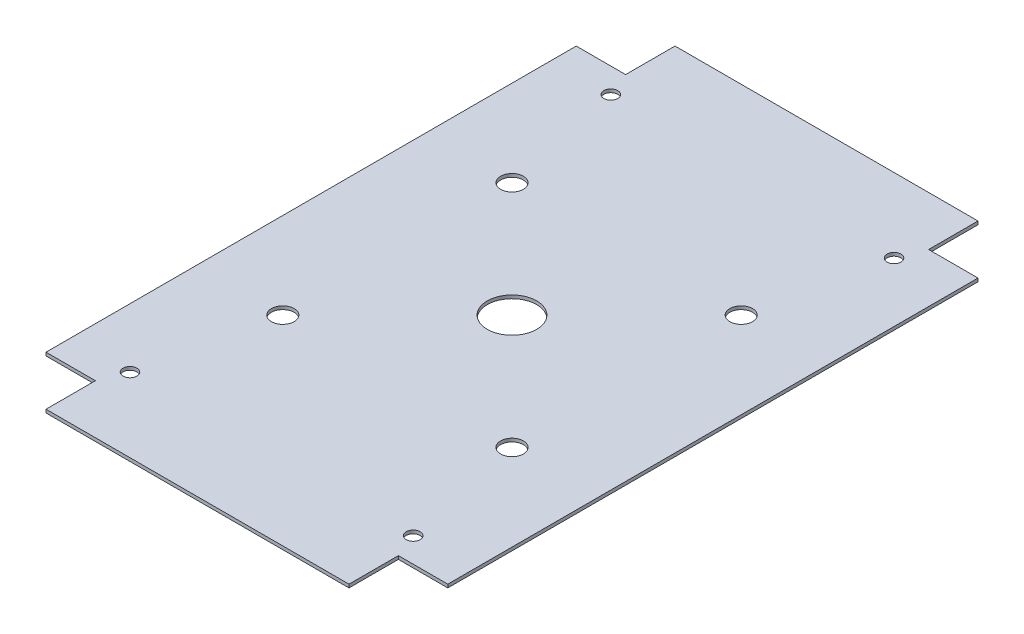
ISO-10303-21;
HEADER;
FILE_DESCRIPTION(('STEP AP214'),'2;1');
FILE_NAME('part.step','',(''),(''),'','','');
FILE_SCHEMA(('AUTOMOTIVE_DESIGN { 1 0 10303 214 1 1 1 1 }'));
ENDSEC;
DATA;
#1=APPLICATION_CONTEXT('core data for automotive mechanical design processes');
#2=APPLICATION_PROTOCOL_DEFINITION('international standard','automotive_design',2000,#1);
#3=PRODUCT_CONTEXT('',#1,'mechanical');
#4=PRODUCT('Part','Part','',(#3));
#5=PRODUCT_RELATED_PRODUCT_CATEGORY('part','',(#4));
#6=PRODUCT_DEFINITION_FORMATION('','',#4);
#7=PRODUCT_DEFINITION_CONTEXT('part definition',#1,'design');
#8=PRODUCT_DEFINITION('design','',#6,#7);
#9=PRODUCT_DEFINITION_SHAPE('','',#8);
#10=(LENGTH_UNIT() NAMED_UNIT(*) SI_UNIT(.MILLI.,.METRE.));
#11=(NAMED_UNIT(*) PLANE_ANGLE_UNIT() SI_UNIT($,.RADIAN.));
#12=(NAMED_UNIT(*) SI_UNIT($,.STERADIAN.) SOLID_ANGLE_UNIT());
#13=UNCERTAINTY_MEASURE_WITH_UNIT(LENGTH_MEASURE(1.E-05),#10,'distance_accuracy_value','');
#14=(GEOMETRIC_REPRESENTATION_CONTEXT(3) GLOBAL_UNCERTAINTY_ASSIGNED_CONTEXT((#13)) GLOBAL_UNIT_ASSIGNED_CONTEXT((#10,
#11,#12)) REPRESENTATION_CONTEXT('',''));
#15=CARTESIAN_POINT('',(0.,0.,0.));
#16=DIRECTION('',(0.,0.,1.));
#17=DIRECTION('',(1.,0.,0.));
#18=AXIS2_PLACEMENT_3D('',#15,#16,#17);
#19=CARTESIAN_POINT('',(-46.,1.,0.));
#20=DIRECTION('',(-1.,0.,0.));
#21=DIRECTION('',(0.,0.,1.));
#22=AXIS2_PLACEMENT_3D('',#19,#20,#21);
#23=PLANE('',#22);
#24=DIRECTION('',(0.,0.,-1.));
#25=VECTOR('',#24,1.);
#26=CARTESIAN_POINT('',(-46.,0.,0.));
#27=LINE('',#26,#25);
#28=CARTESIAN_POINT('',(-46.,0.,95.5));
#29=VERTEX_POINT('',#28);
#30=CARTESIAN_POINT('',(-46.,0.,80.5));
#31=VERTEX_POINT('',#30);
#32=EDGE_CURVE('E182',#29,#31,#27,.T.);
#33=ORIENTED_EDGE('',*,*,#32,.F.);
#34=DIRECTION('',(0.,-1.,0.));
#35=VECTOR('',#34,1.);
#36=CARTESIAN_POINT('',(-46.,1.,95.5));
#37=LINE('',#36,#35);
#38=CARTESIAN_POINT('',(-46.,1.,95.5));
#39=VERTEX_POINT('',#38);
#40=EDGE_CURVE('E11',#39,#29,#37,.T.);
#41=ORIENTED_EDGE('',*,*,#40,.F.);
#42=DIRECTION('',(0.,0.,-1.));
#43=VECTOR('',#42,1.);
#44=CARTESIAN_POINT('',(-46.,1.,0.));
#45=LINE('',#44,#43);
#46=CARTESIAN_POINT('',(-46.,1.,80.5));
#47=VERTEX_POINT('',#46);
#48=EDGE_CURVE('E255',#39,#47,#45,.T.);
#49=ORIENTED_EDGE('',*,*,#48,.T.);
#50=DIRECTION('',(0.,-1.,0.));
#51=VECTOR('',#50,1.);
#52=CARTESIAN_POINT('',(-46.,1.,80.5));
#53=LINE('',#52,#51);
#54=EDGE_CURVE('E54',#47,#31,#53,.T.);
#55=ORIENTED_EDGE('',*,*,#54,.T.);
#56=EDGE_LOOP('',(#33,#41,#49,#55));
#57=FACE_BOUND('',#56,.T.);
#58=ADVANCED_FACE('F37',(#57),#23,.T.);
#59=CARTESIAN_POINT('',(0.,1.,95.5));
#60=DIRECTION('',(0.,0.,1.));
#61=DIRECTION('',(1.,0.,0.));
#62=AXIS2_PLACEMENT_3D('',#59,#60,#61);
#63=PLANE('',#62);
#64=DIRECTION('',(-1.,0.,0.));
#65=VECTOR('',#64,1.);
#66=CARTESIAN_POINT('',(0.,0.,95.5));
#67=LINE('',#66,#65);
#68=CARTESIAN_POINT('',(46.,0.,95.5));
#69=VERTEX_POINT('',#68);
#70=EDGE_CURVE('E184',#69,#29,#67,.T.);
#71=ORIENTED_EDGE('',*,*,#70,.F.);
#72=DIRECTION('',(0.,-1.,0.));
#73=VECTOR('',#72,1.);
#74=CARTESIAN_POINT('',(46.,1.,95.5));
#75=LINE('',#74,#73);
#76=CARTESIAN_POINT('',(46.,1.,95.5));
#77=VERTEX_POINT('',#76);
#78=EDGE_CURVE('E46',#77,#69,#75,.T.);
#79=ORIENTED_EDGE('',*,*,#78,.F.);
#80=DIRECTION('',(-1.,0.,0.));
#81=VECTOR('',#80,1.);
#82=CARTESIAN_POINT('',(0.,1.,95.5));
#83=LINE('',#82,#81);
#84=EDGE_CURVE('E251',#77,#39,#83,.T.);
#85=ORIENTED_EDGE('',*,*,#84,.T.);
#86=ORIENTED_EDGE('',*,*,#40,.T.);
#87=EDGE_LOOP('',(#71,#79,#85,#86));
#88=FACE_BOUND('',#87,.T.);
#89=ADVANCED_FACE('F239',(#88),#63,.T.);
#90=CARTESIAN_POINT('',(46.,1.,0.));
#91=DIRECTION('',(1.,0.,0.));
#92=DIRECTION('',(0.,0.,-1.));
#93=AXIS2_PLACEMENT_3D('',#90,#91,#92);
#94=PLANE('',#93);
#95=DIRECTION('',(0.,0.,1.));
#96=VECTOR('',#95,1.);
#97=CARTESIAN_POINT('',(46.,0.,0.));
#98=LINE('',#97,#96);
#99=CARTESIAN_POINT('',(46.,0.,80.5));
#100=VERTEX_POINT('',#99);
#101=EDGE_CURVE('E187',#100,#69,#98,.T.);
#102=ORIENTED_EDGE('',*,*,#101,.F.);
#103=DIRECTION('',(0.,-1.,0.));
#104=VECTOR('',#103,1.);
#105=CARTESIAN_POINT('',(46.,1.,80.5));
#106=LINE('',#105,#104);
#107=CARTESIAN_POINT('',(46.,1.,80.5));
#108=VERTEX_POINT('',#107);
#109=EDGE_CURVE('E228',#108,#100,#106,.T.);
#110=ORIENTED_EDGE('',*,*,#109,.F.);
#111=DIRECTION('',(0.,0.,1.));
#112=VECTOR('',#111,1.);
#113=CARTESIAN_POINT('',(46.,1.,0.));
#114=LINE('',#113,#112);
#115=EDGE_CURVE('E235',#108,#77,#114,.T.);
#116=ORIENTED_EDGE('',*,*,#115,.T.);
#117=ORIENTED_EDGE('',*,*,#78,.T.);
#118=EDGE_LOOP('',(#102,#110,#116,#117));
#119=FACE_BOUND('',#118,.T.);
#120=ADVANCED_FACE('F233',(#119),#94,.T.);
#121=CARTESIAN_POINT('',(0.,1.,80.5));
#122=DIRECTION('',(0.,0.,1.));
#123=DIRECTION('',(1.,0.,0.));
#124=AXIS2_PLACEMENT_3D('',#121,#122,#123);
#125=PLANE('',#124);
#126=DIRECTION('',(-1.,0.,0.));
#127=VECTOR('',#126,1.);
#128=CARTESIAN_POINT('',(0.,0.,80.5));
#129=LINE('',#128,#127);
#130=CARTESIAN_POINT('',(61.,0.,80.5));
#131=VERTEX_POINT('',#130);
#132=EDGE_CURVE('E190',#131,#100,#129,.T.);
#133=ORIENTED_EDGE('',*,*,#132,.F.);
#134=DIRECTION('',(0.,-1.,0.));
#135=VECTOR('',#134,1.);
#136=CARTESIAN_POINT('',(61.,1.,80.5));
#137=LINE('',#136,#135);
#138=CARTESIAN_POINT('',(61.,1.,80.5));
#139=VERTEX_POINT('',#138);
#140=EDGE_CURVE('E226',#139,#131,#137,.T.);
#141=ORIENTED_EDGE('',*,*,#140,.F.);
#142=DIRECTION('',(-1.,0.,0.));
#143=VECTOR('',#142,1.);
#144=CARTESIAN_POINT('',(0.,1.,80.5));
#145=LINE('',#144,#143);
#146=EDGE_CURVE('E248',#139,#108,#145,.T.);
#147=ORIENTED_EDGE('',*,*,#146,.T.);
#148=ORIENTED_EDGE('',*,*,#109,.T.);
#149=EDGE_LOOP('',(#133,#141,#147,#148));
#150=FACE_BOUND('',#149,.T.);
#151=ADVANCED_FACE('F245',(#150),#125,.T.);
#152=CARTESIAN_POINT('',(61.,1.,0.));
#153=DIRECTION('',(1.,0.,0.));
#154=DIRECTION('',(0.,0.,-1.));
#155=AXIS2_PLACEMENT_3D('',#152,#153,#154);
#156=PLANE('',#155);
#157=DIRECTION('',(0.,0.,1.));
#158=VECTOR('',#157,1.);
#159=CARTESIAN_POINT('',(61.,0.,0.));
#160=LINE('',#159,#158);
#161=CARTESIAN_POINT('',(61.,0.,-80.5));
#162=VERTEX_POINT('',#161);
#163=EDGE_CURVE('E193',#162,#131,#160,.T.);
#164=ORIENTED_EDGE('',*,*,#163,.F.);
#165=DIRECTION('',(0.,-1.,0.));
#166=VECTOR('',#165,1.);
#167=CARTESIAN_POINT('',(61.,1.,-80.5));
#168=LINE('',#167,#166);
#169=CARTESIAN_POINT('',(61.,1.,-80.5));
#170=VERTEX_POINT('',#169);
#171=EDGE_CURVE('E224',#170,#162,#168,.T.);
#172=ORIENTED_EDGE('',*,*,#171,.F.);
#173=DIRECTION('',(0.,0.,1.));
#174=VECTOR('',#173,1.);
#175=CARTESIAN_POINT('',(61.,1.,0.));
#176=LINE('',#175,#174);
#177=EDGE_CURVE('E253',#170,#139,#176,.T.);
#178=ORIENTED_EDGE('',*,*,#177,.T.);
#179=ORIENTED_EDGE('',*,*,#140,.T.);
#180=EDGE_LOOP('',(#164,#172,#178,#179));
#181=FACE_BOUND('',#180,.T.);
#182=ADVANCED_FACE('F470',(#181),#156,.T.);
#183=CARTESIAN_POINT('',(0.,1.,-80.5));
#184=DIRECTION('',(0.,0.,-1.));
#185=DIRECTION('',(-1.,0.,0.));
#186=AXIS2_PLACEMENT_3D('',#183,#184,#185);
#187=PLANE('',#186);
#188=DIRECTION('',(1.,0.,0.));
#189=VECTOR('',#188,1.);
#190=CARTESIAN_POINT('',(0.,0.,-80.5));
#191=LINE('',#190,#189);
#192=CARTESIAN_POINT('',(46.,0.,-80.5));
#193=VERTEX_POINT('',#192);
#194=EDGE_CURVE('E196',#193,#162,#191,.T.);
#195=ORIENTED_EDGE('',*,*,#194,.F.);
#196=DIRECTION('',(0.,-1.,0.));
#197=VECTOR('',#196,1.);
#198=CARTESIAN_POINT('',(46.,1.,-80.5));
#199=LINE('',#198,#197);
#200=CARTESIAN_POINT('',(46.,1.,-80.5));
#201=VERTEX_POINT('',#200);
#202=EDGE_CURVE('E222',#201,#193,#199,.T.);
#203=ORIENTED_EDGE('',*,*,#202,.F.);
#204=DIRECTION('',(1.,0.,0.));
#205=VECTOR('',#204,1.);
#206=CARTESIAN_POINT('',(0.,1.,-80.5));
#207=LINE('',#206,#205);
#208=EDGE_CURVE('E260',#201,#170,#207,.T.);
#209=ORIENTED_EDGE('',*,*,#208,.T.);
#210=ORIENTED_EDGE('',*,*,#171,.T.);
#211=EDGE_LOOP('',(#195,#203,#209,#210));
#212=FACE_BOUND('',#211,.T.);
#213=ADVANCED_FACE('F460',(#212),#187,.T.);
#214=CARTESIAN_POINT('',(46.,1.,0.));
#215=DIRECTION('',(1.,0.,0.));
#216=DIRECTION('',(0.,0.,-1.));
#217=AXIS2_PLACEMENT_3D('',#214,#215,#216);
#218=PLANE('',#217);
#219=DIRECTION('',(0.,0.,1.));
#220=VECTOR('',#219,1.);
#221=CARTESIAN_POINT('',(46.,0.,0.));
#222=LINE('',#221,#220);
#223=CARTESIAN_POINT('',(46.,0.,-95.5));
#224=VERTEX_POINT('',#223);
#225=EDGE_CURVE('E199',#224,#193,#222,.T.);
#226=ORIENTED_EDGE('',*,*,#225,.F.);
#227=DIRECTION('',(0.,-1.,0.));
#228=VECTOR('',#227,1.);
#229=CARTESIAN_POINT('',(46.,1.,-95.5));
#230=LINE('',#229,#228);
#231=CARTESIAN_POINT('',(46.,1.,-95.5));
#232=VERTEX_POINT('',#231);
#233=EDGE_CURVE('E220',#232,#224,#230,.T.);
#234=ORIENTED_EDGE('',*,*,#233,.F.);
#235=DIRECTION('',(0.,0.,1.));
#236=VECTOR('',#235,1.);
#237=CARTESIAN_POINT('',(46.,1.,0.));
#238=LINE('',#237,#236);
#239=EDGE_CURVE('E263',#232,#201,#238,.T.);
#240=ORIENTED_EDGE('',*,*,#239,.T.);
#241=ORIENTED_EDGE('',*,*,#202,.T.);
#242=EDGE_LOOP('',(#226,#234,#240,#241));
#243=FACE_BOUND('',#242,.T.);
#244=ADVANCED_FACE('F450',(#243),#218,.T.);
#245=CARTESIAN_POINT('',(0.,1.,-95.5));
#246=DIRECTION('',(0.,0.,-1.));
#247=DIRECTION('',(-1.,0.,0.));
#248=AXIS2_PLACEMENT_3D('',#245,#246,#247);
#249=PLANE('',#248);
#250=DIRECTION('',(1.,0.,0.));
#251=VECTOR('',#250,1.);
#252=CARTESIAN_POINT('',(0.,0.,-95.5));
#253=LINE('',#252,#251);
#254=CARTESIAN_POINT('',(-46.,0.,-95.5));
#255=VERTEX_POINT('',#254);
#256=EDGE_CURVE('E202',#255,#224,#253,.T.);
#257=ORIENTED_EDGE('',*,*,#256,.F.);
#258=DIRECTION('',(0.,-1.,0.));
#259=VECTOR('',#258,1.);
#260=CARTESIAN_POINT('',(-46.,1.,-95.5));
#261=LINE('',#260,#259);
#262=CARTESIAN_POINT('',(-46.,1.,-95.5));
#263=VERTEX_POINT('',#262);
#264=EDGE_CURVE('E218',#263,#255,#261,.T.);
#265=ORIENTED_EDGE('',*,*,#264,.F.);
#266=DIRECTION('',(1.,0.,0.));
#267=VECTOR('',#266,1.);
#268=CARTESIAN_POINT('',(0.,1.,-95.5));
#269=LINE('',#268,#267);
#270=EDGE_CURVE('E266',#263,#232,#269,.T.);
#271=ORIENTED_EDGE('',*,*,#270,.T.);
#272=ORIENTED_EDGE('',*,*,#233,.T.);
#273=EDGE_LOOP('',(#257,#265,#271,#272));
#274=FACE_BOUND('',#273,.T.);
#275=ADVANCED_FACE('F441',(#274),#249,.T.);
#276=CARTESIAN_POINT('',(-46.,1.,0.));
#277=DIRECTION('',(-1.,0.,0.));
#278=DIRECTION('',(0.,0.,1.));
#279=AXIS2_PLACEMENT_3D('',#276,#277,#278);
#280=PLANE('',#279);
#281=DIRECTION('',(0.,0.,-1.));
#282=VECTOR('',#281,1.);
#283=CARTESIAN_POINT('',(-46.,0.,0.));
#284=LINE('',#283,#282);
#285=CARTESIAN_POINT('',(-46.,0.,-80.5));
#286=VERTEX_POINT('',#285);
#287=EDGE_CURVE('E205',#286,#255,#284,.T.);
#288=ORIENTED_EDGE('',*,*,#287,.F.);
#289=DIRECTION('',(0.,-1.,0.));
#290=VECTOR('',#289,1.);
#291=CARTESIAN_POINT('',(-46.,1.,-80.5));
#292=LINE('',#291,#290);
#293=CARTESIAN_POINT('',(-46.,1.,-80.5));
#294=VERTEX_POINT('',#293);
#295=EDGE_CURVE('E137',#294,#286,#292,.T.);
#296=ORIENTED_EDGE('',*,*,#295,.F.);
#297=DIRECTION('',(0.,0.,-1.));
#298=VECTOR('',#297,1.);
#299=CARTESIAN_POINT('',(-46.,1.,0.));
#300=LINE('',#299,#298);
#301=EDGE_CURVE('E147',#294,#263,#300,.T.);
#302=ORIENTED_EDGE('',*,*,#301,.T.);
#303=ORIENTED_EDGE('',*,*,#264,.T.);
#304=EDGE_LOOP('',(#288,#296,#302,#303));
#305=FACE_BOUND('',#304,.T.);
#306=ADVANCED_FACE('F270',(#305),#280,.T.);
#307=CARTESIAN_POINT('',(0.,1.,-80.5));
#308=DIRECTION('',(0.,0.,-1.));
#309=DIRECTION('',(-1.,0.,0.));
#310=AXIS2_PLACEMENT_3D('',#307,#308,#309);
#311=PLANE('',#310);
#312=DIRECTION('',(1.,0.,0.));
#313=VECTOR('',#312,1.);
#314=CARTESIAN_POINT('',(0.,0.,-80.5));
#315=LINE('',#314,#313);
#316=CARTESIAN_POINT('',(-61.,0.,-80.5));
#317=VERTEX_POINT('',#316);
#318=EDGE_CURVE('E133',#317,#286,#315,.T.);
#319=ORIENTED_EDGE('',*,*,#318,.F.);
#320=DIRECTION('',(0.,-1.,0.));
#321=VECTOR('',#320,1.);
#322=CARTESIAN_POINT('',(-61.,1.,-80.5));
#323=LINE('',#322,#321);
#324=CARTESIAN_POINT('',(-61.,1.,-80.5));
#325=VERTEX_POINT('',#324);
#326=EDGE_CURVE('E128',#325,#317,#323,.T.);
#327=ORIENTED_EDGE('',*,*,#326,.F.);
#328=DIRECTION('',(1.,0.,0.));
#329=VECTOR('',#328,1.);
#330=CARTESIAN_POINT('',(0.,1.,-80.5));
#331=LINE('',#330,#329);
#332=EDGE_CURVE('E131',#325,#294,#331,.T.);
#333=ORIENTED_EDGE('',*,*,#332,.T.);
#334=ORIENTED_EDGE('',*,*,#295,.T.);
#335=EDGE_LOOP('',(#319,#327,#333,#334));
#336=FACE_BOUND('',#335,.T.);
#337=ADVANCED_FACE('F130',(#336),#311,.T.);
#338=CARTESIAN_POINT('',(-61.,1.,0.));
#339=DIRECTION('',(-1.,0.,0.));
#340=DIRECTION('',(0.,0.,1.));
#341=AXIS2_PLACEMENT_3D('',#338,#339,#340);
#342=PLANE('',#341);
#343=DIRECTION('',(0.,0.,-1.));
#344=VECTOR('',#343,1.);
#345=CARTESIAN_POINT('',(-61.,0.,0.));
#346=LINE('',#345,#344);
#347=CARTESIAN_POINT('',(-61.,0.,80.5));
#348=VERTEX_POINT('',#347);
#349=EDGE_CURVE('E209',#348,#317,#346,.T.);
#350=ORIENTED_EDGE('',*,*,#349,.F.);
#351=DIRECTION('',(0.,-1.,0.));
#352=VECTOR('',#351,1.);
#353=CARTESIAN_POINT('',(-61.,1.,80.5));
#354=LINE('',#353,#352);
#355=CARTESIAN_POINT('',(-61.,1.,80.5));
#356=VERTEX_POINT('',#355);
#357=EDGE_CURVE('E91',#356,#348,#354,.T.);
#358=ORIENTED_EDGE('',*,*,#357,.F.);
#359=DIRECTION('',(0.,0.,-1.));
#360=VECTOR('',#359,1.);
#361=CARTESIAN_POINT('',(-61.,1.,0.));
#362=LINE('',#361,#360);
#363=EDGE_CURVE('E144',#356,#325,#362,.T.);
#364=ORIENTED_EDGE('',*,*,#363,.T.);
#365=ORIENTED_EDGE('',*,*,#326,.T.);
#366=EDGE_LOOP('',(#350,#358,#364,#365));
#367=FACE_BOUND('',#366,.T.);
#368=ADVANCED_FACE('F149',(#367),#342,.T.);
#369=CARTESIAN_POINT('',(-34.8,1.,-34.8));
#370=DIRECTION('',(0.,-1.,0.));
#371=DIRECTION('',(0.,0.,-1.));
#372=AXIS2_PLACEMENT_3D('',#369,#370,#371);
#373=CYLINDRICAL_SURFACE('',#372,3.45);
#374=CARTESIAN_POINT('',(-34.8,1.,-34.8));
#375=DIRECTION('',(0.,1.,0.));
#376=DIRECTION('',(0.,0.,1.));
#377=AXIS2_PLACEMENT_3D('',#374,#375,#376);
#378=CIRCLE('',#377,3.45);
#379=CARTESIAN_POINT('',(-34.8,1.,-31.35));
#380=VERTEX_POINT('',#379);
#381=EDGE_CURVE('E538',#380,#380,#378,.T.);
#382=ORIENTED_EDGE('',*,*,#381,.T.);
#383=EDGE_LOOP('',(#382));
#384=FACE_BOUND('',#383,.T.);
#385=CARTESIAN_POINT('',(-34.8,0.,-34.8));
#386=DIRECTION('',(0.,1.,0.));
#387=DIRECTION('',(0.,0.,1.));
#388=AXIS2_PLACEMENT_3D('',#385,#386,#387);
#389=CIRCLE('',#388,3.45);
#390=CARTESIAN_POINT('',(-34.8,0.,-31.35));
#391=VERTEX_POINT('',#390);
#392=EDGE_CURVE('E179',#391,#391,#389,.T.);
#393=ORIENTED_EDGE('',*,*,#392,.F.);
#394=EDGE_LOOP('',(#393));
#395=FACE_BOUND('',#394,.T.);
#396=ADVANCED_FACE('F293',(#384,#395),#373,.F.);
#397=CARTESIAN_POINT('',(34.8,1.,-34.8));
#398=DIRECTION('',(0.,-1.,0.));
#399=DIRECTION('',(0.,0.,-1.));
#400=AXIS2_PLACEMENT_3D('',#397,#398,#399);
#401=CYLINDRICAL_SURFACE('',#400,3.45);
#402=CARTESIAN_POINT('',(34.8,1.,-34.8));
#403=DIRECTION('',(0.,1.,0.));
#404=DIRECTION('',(0.,0.,1.));
#405=AXIS2_PLACEMENT_3D('',#402,#403,#404);
#406=CIRCLE('',#405,3.45);
#407=CARTESIAN_POINT('',(34.8,1.,-31.35));
#408=VERTEX_POINT('',#407);
#409=EDGE_CURVE('E535',#408,#408,#406,.T.);
#410=ORIENTED_EDGE('',*,*,#409,.T.);
#411=EDGE_LOOP('',(#410));
#412=FACE_BOUND('',#411,.T.);
#413=CARTESIAN_POINT('',(34.8,0.,-34.8));
#414=DIRECTION('',(0.,1.,0.));
#415=DIRECTION('',(0.,0.,1.));
#416=AXIS2_PLACEMENT_3D('',#413,#414,#415);
#417=CIRCLE('',#416,3.45);
#418=CARTESIAN_POINT('',(34.8,0.,-31.35));
#419=VERTEX_POINT('',#418);
#420=EDGE_CURVE('E176',#419,#419,#417,.T.);
#421=ORIENTED_EDGE('',*,*,#420,.F.);
#422=EDGE_LOOP('',(#421));
#423=FACE_BOUND('',#422,.T.);
#424=ADVANCED_FACE('F296',(#412,#423),#401,.F.);
#425=CARTESIAN_POINT('',(34.8,1.,34.8));
#426=DIRECTION('',(0.,-1.,0.));
#427=DIRECTION('',(0.,0.,-1.));
#428=AXIS2_PLACEMENT_3D('',#425,#426,#427);
#429=CYLINDRICAL_SURFACE('',#428,3.45);
#430=CARTESIAN_POINT('',(34.8,1.,34.8));
#431=DIRECTION('',(0.,1.,0.));
#432=DIRECTION('',(0.,0.,1.));
#433=AXIS2_PLACEMENT_3D('',#430,#431,#432);
#434=CIRCLE('',#433,3.45);
#435=CARTESIAN_POINT('',(34.8,1.,38.25));
#436=VERTEX_POINT('',#435);
#437=EDGE_CURVE('E532',#436,#436,#434,.T.);
#438=ORIENTED_EDGE('',*,*,#437,.T.);
#439=EDGE_LOOP('',(#438));
#440=FACE_BOUND('',#439,.T.);
#441=CARTESIAN_POINT('',(34.8,0.,34.8));
#442=DIRECTION('',(0.,1.,0.));
#443=DIRECTION('',(0.,0.,1.));
#444=AXIS2_PLACEMENT_3D('',#441,#442,#443);
#445=CIRCLE('',#444,3.45);
#446=CARTESIAN_POINT('',(34.8,0.,38.25));
#447=VERTEX_POINT('',#446);
#448=EDGE_CURVE('E173',#447,#447,#445,.T.);
#449=ORIENTED_EDGE('',*,*,#448,.F.);
#450=EDGE_LOOP('',(#449));
#451=FACE_BOUND('',#450,.T.);
#452=ADVANCED_FACE('F300',(#440,#451),#429,.F.);
#453=CARTESIAN_POINT('',(-34.8,1.,34.8));
#454=DIRECTION('',(0.,-1.,0.));
#455=DIRECTION('',(0.,0.,-1.));
#456=AXIS2_PLACEMENT_3D('',#453,#454,#455);
#457=CYLINDRICAL_SURFACE('',#456,3.45);
#458=CARTESIAN_POINT('',(-34.8,1.,34.8));
#459=DIRECTION('',(0.,1.,0.));
#460=DIRECTION('',(0.,0.,1.));
#461=AXIS2_PLACEMENT_3D('',#458,#459,#460);
#462=CIRCLE('',#461,3.45);
#463=CARTESIAN_POINT('',(-34.8,1.,38.25));
#464=VERTEX_POINT('',#463);
#465=EDGE_CURVE('E529',#464,#464,#462,.T.);
#466=ORIENTED_EDGE('',*,*,#465,.T.);
#467=EDGE_LOOP('',(#466));
#468=FACE_BOUND('',#467,.T.);
#469=CARTESIAN_POINT('',(-34.8,0.,34.8));
#470=DIRECTION('',(0.,1.,0.));
#471=DIRECTION('',(0.,0.,1.));
#472=AXIS2_PLACEMENT_3D('',#469,#470,#471);
#473=CIRCLE('',#472,3.45);
#474=CARTESIAN_POINT('',(-34.8,0.,38.25));
#475=VERTEX_POINT('',#474);
#476=EDGE_CURVE('E170',#475,#475,#473,.T.);
#477=ORIENTED_EDGE('',*,*,#476,.F.);
#478=EDGE_LOOP('',(#477));
#479=FACE_BOUND('',#478,.T.);
#480=ADVANCED_FACE('F304',(#468,#479),#457,.F.);
#481=CARTESIAN_POINT('',(0.,1.,0.));
#482=DIRECTION('',(0.,-1.,0.));
#483=DIRECTION('',(0.,0.,-1.));
#484=AXIS2_PLACEMENT_3D('',#481,#482,#483);
#485=CYLINDRICAL_SURFACE('',#484,7.5);
#486=CARTESIAN_POINT('',(0.,1.,0.));
#487=DIRECTION('',(0.,1.,0.));
#488=DIRECTION('',(0.,0.,1.));
#489=AXIS2_PLACEMENT_3D('',#486,#487,#488);
#490=CIRCLE('',#489,7.5);
#491=CARTESIAN_POINT('',(0.,1.,7.5));
#492=VERTEX_POINT('',#491);
#493=EDGE_CURVE('E526',#492,#492,#490,.T.);
#494=ORIENTED_EDGE('',*,*,#493,.T.);
#495=EDGE_LOOP('',(#494));
#496=FACE_BOUND('',#495,.T.);
#497=CARTESIAN_POINT('',(0.,0.,0.));
#498=DIRECTION('',(0.,1.,0.));
#499=DIRECTION('',(0.,0.,1.));
#500=AXIS2_PLACEMENT_3D('',#497,#498,#499);
#501=CIRCLE('',#500,7.5);
#502=CARTESIAN_POINT('',(0.,0.,7.5));
#503=VERTEX_POINT('',#502);
#504=EDGE_CURVE('E167',#503,#503,#501,.T.);
#505=ORIENTED_EDGE('',*,*,#504,.F.);
#506=EDGE_LOOP('',(#505));
#507=FACE_BOUND('',#506,.T.);
#508=ADVANCED_FACE('F308',(#496,#507),#485,.F.);
#509=CARTESIAN_POINT('',(-43.,1.,73.));
#510=DIRECTION('',(0.,-1.,0.));
#511=DIRECTION('',(0.,0.,-1.));
#512=AXIS2_PLACEMENT_3D('',#509,#510,#511);
#513=CYLINDRICAL_SURFACE('',#512,2.1);
#514=CARTESIAN_POINT('',(-43.,1.,73.));
#515=DIRECTION('',(0.,1.,0.));
#516=DIRECTION('',(0.,0.,1.));
#517=AXIS2_PLACEMENT_3D('',#514,#515,#516);
#518=CIRCLE('',#517,2.1);
#519=CARTESIAN_POINT('',(-43.,1.,75.1));
#520=VERTEX_POINT('',#519);
#521=EDGE_CURVE('E519',#520,#520,#518,.T.);
#522=ORIENTED_EDGE('',*,*,#521,.T.);
#523=EDGE_LOOP('',(#522));
#524=FACE_BOUND('',#523,.T.);
#525=CARTESIAN_POINT('',(-43.,0.,73.));
#526=DIRECTION('',(0.,1.,0.));
#527=DIRECTION('',(0.,0.,1.));
#528=AXIS2_PLACEMENT_3D('',#525,#526,#527);
#529=CIRCLE('',#528,2.1);
#530=CARTESIAN_POINT('',(-43.,0.,75.1));
#531=VERTEX_POINT('',#530);
#532=EDGE_CURVE('E164',#531,#531,#529,.T.);
#533=ORIENTED_EDGE('',*,*,#532,.F.);
#534=EDGE_LOOP('',(#533));
#535=FACE_BOUND('',#534,.T.);
#536=ADVANCED_FACE('F312',(#524,#535),#513,.F.);
#537=CARTESIAN_POINT('',(43.,1.,73.));
#538=DIRECTION('',(0.,-1.,0.));
#539=DIRECTION('',(0.,0.,-1.));
#540=AXIS2_PLACEMENT_3D('',#537,#538,#539);
#541=CYLINDRICAL_SURFACE('',#540,2.1);
#542=CARTESIAN_POINT('',(43.,1.,73.));
#543=DIRECTION('',(0.,1.,0.));
#544=DIRECTION('',(0.,0.,1.));
#545=AXIS2_PLACEMENT_3D('',#542,#543,#544);
#546=CIRCLE('',#545,2.1);
#547=CARTESIAN_POINT('',(43.,1.,75.1));
#548=VERTEX_POINT('',#547);
#549=EDGE_CURVE('E516',#548,#548,#546,.T.);
#550=ORIENTED_EDGE('',*,*,#549,.T.);
#551=EDGE_LOOP('',(#550));
#552=FACE_BOUND('',#551,.T.);
#553=CARTESIAN_POINT('',(43.,0.,73.));
#554=DIRECTION('',(0.,1.,0.));
#555=DIRECTION('',(0.,0.,1.));
#556=AXIS2_PLACEMENT_3D('',#553,#554,#555);
#557=CIRCLE('',#556,2.1);
#558=CARTESIAN_POINT('',(43.,0.,75.1));
#559=VERTEX_POINT('',#558);
#560=EDGE_CURVE('E161',#559,#559,#557,.T.);
#561=ORIENTED_EDGE('',*,*,#560,.F.);
#562=EDGE_LOOP('',(#561));
#563=FACE_BOUND('',#562,.T.);
#564=ADVANCED_FACE('F316',(#552,#563),#541,.F.);
#565=CARTESIAN_POINT('',(-43.,1.,-73.));
#566=DIRECTION('',(0.,-1.,0.));
#567=DIRECTION('',(0.,0.,-1.));
#568=AXIS2_PLACEMENT_3D('',#565,#566,#567);
#569=CYLINDRICAL_SURFACE('',#568,2.1);
#570=CARTESIAN_POINT('',(-43.,1.,-73.));
#571=DIRECTION('',(0.,1.,0.));
#572=DIRECTION('',(0.,0.,1.));
#573=AXIS2_PLACEMENT_3D('',#570,#571,#572);
#574=CIRCLE('',#573,2.1);
#575=CARTESIAN_POINT('',(-43.,1.,-70.9));
#576=VERTEX_POINT('',#575);
#577=EDGE_CURVE('E327',#576,#576,#574,.T.);
#578=ORIENTED_EDGE('',*,*,#577,.T.);
#579=EDGE_LOOP('',(#578));
#580=FACE_BOUND('',#579,.T.);
#581=CARTESIAN_POINT('',(-43.,0.,-73.));
#582=DIRECTION('',(0.,1.,0.));
#583=DIRECTION('',(0.,0.,1.));
#584=AXIS2_PLACEMENT_3D('',#581,#582,#583);
#585=CIRCLE('',#584,2.1);
#586=CARTESIAN_POINT('',(-43.,0.,-70.9));
#587=VERTEX_POINT('',#586);
#588=EDGE_CURVE('E158',#587,#587,#585,.T.);
#589=ORIENTED_EDGE('',*,*,#588,.F.);
#590=EDGE_LOOP('',(#589));
#591=FACE_BOUND('',#590,.T.);
#592=ADVANCED_FACE('F281',(#580,#591),#569,.F.);
#593=CARTESIAN_POINT('',(43.,1.,-73.));
#594=DIRECTION('',(0.,-1.,0.));
#595=DIRECTION('',(0.,0.,-1.));
#596=AXIS2_PLACEMENT_3D('',#593,#594,#595);
#597=CYLINDRICAL_SURFACE('',#596,2.1);
#598=CARTESIAN_POINT('',(43.,1.,-73.));
#599=DIRECTION('',(0.,1.,0.));
#600=DIRECTION('',(0.,0.,1.));
#601=AXIS2_PLACEMENT_3D('',#598,#599,#600);
#602=CIRCLE('',#601,2.1);
#603=CARTESIAN_POINT('',(43.,1.,-70.9));
#604=VERTEX_POINT('',#603);
#605=EDGE_CURVE('E214',#604,#604,#602,.T.);
#606=ORIENTED_EDGE('',*,*,#605,.T.);
#607=EDGE_LOOP('',(#606));
#608=FACE_BOUND('',#607,.T.);
#609=CARTESIAN_POINT('',(43.,0.,-73.));
#610=DIRECTION('',(0.,1.,0.));
#611=DIRECTION('',(0.,0.,1.));
#612=AXIS2_PLACEMENT_3D('',#609,#610,#611);
#613=CIRCLE('',#612,2.1);
#614=CARTESIAN_POINT('',(43.,0.,-70.9));
#615=VERTEX_POINT('',#614);
#616=EDGE_CURVE('E155',#615,#615,#613,.T.);
#617=ORIENTED_EDGE('',*,*,#616,.F.);
#618=EDGE_LOOP('',(#617));
#619=FACE_BOUND('',#618,.T.);
#620=ADVANCED_FACE('F39',(#608,#619),#597,.F.);
#621=CARTESIAN_POINT('',(0.,1.,80.5));
#622=DIRECTION('',(0.,0.,1.));
#623=DIRECTION('',(1.,0.,0.));
#624=AXIS2_PLACEMENT_3D('',#621,#622,#623);
#625=PLANE('',#624);
#626=DIRECTION('',(-1.,0.,0.));
#627=VECTOR('',#626,1.);
#628=CARTESIAN_POINT('',(0.,0.,80.5));
#629=LINE('',#628,#627);
#630=EDGE_CURVE('E211',#31,#348,#629,.T.);
#631=ORIENTED_EDGE('',*,*,#630,.F.);
#632=ORIENTED_EDGE('',*,*,#54,.F.);
#633=DIRECTION('',(-1.,0.,0.));
#634=VECTOR('',#633,1.);
#635=CARTESIAN_POINT('',(0.,1.,80.5));
#636=LINE('',#635,#634);
#637=EDGE_CURVE('E150',#47,#356,#636,.T.);
#638=ORIENTED_EDGE('',*,*,#637,.T.);
#639=ORIENTED_EDGE('',*,*,#357,.T.);
#640=EDGE_LOOP('',(#631,#632,#638,#639));
#641=FACE_BOUND('',#640,.T.);
#642=ADVANCED_FACE('F272',(#641),#625,.T.);
#643=CARTESIAN_POINT('',(0.,1.,0.));
#644=DIRECTION('',(0.,1.,0.));
#645=DIRECTION('',(0.,0.,1.));
#646=AXIS2_PLACEMENT_3D('',#643,#644,#645);
#647=PLANE('',#646);
#648=ORIENTED_EDGE('',*,*,#605,.F.);
#649=EDGE_LOOP('',(#648));
#650=FACE_BOUND('',#649,.T.);
#651=ORIENTED_EDGE('',*,*,#577,.F.);
#652=EDGE_LOOP('',(#651));
#653=FACE_BOUND('',#652,.T.);
#654=ORIENTED_EDGE('',*,*,#549,.F.);
#655=EDGE_LOOP('',(#654));
#656=FACE_BOUND('',#655,.T.);
#657=ORIENTED_EDGE('',*,*,#521,.F.);
#658=EDGE_LOOP('',(#657));
#659=FACE_BOUND('',#658,.T.);
#660=ORIENTED_EDGE('',*,*,#493,.F.);
#661=EDGE_LOOP('',(#660));
#662=FACE_BOUND('',#661,.T.);
#663=ORIENTED_EDGE('',*,*,#465,.F.);
#664=EDGE_LOOP('',(#663));
#665=FACE_BOUND('',#664,.T.);
#666=ORIENTED_EDGE('',*,*,#437,.F.);
#667=EDGE_LOOP('',(#666));
#668=FACE_BOUND('',#667,.T.);
#669=ORIENTED_EDGE('',*,*,#409,.F.);
#670=EDGE_LOOP('',(#669));
#671=FACE_BOUND('',#670,.T.);
#672=ORIENTED_EDGE('',*,*,#381,.F.);
#673=EDGE_LOOP('',(#672));
#674=FACE_BOUND('',#673,.T.);
#675=ORIENTED_EDGE('',*,*,#48,.F.);
#676=ORIENTED_EDGE('',*,*,#84,.F.);
#677=ORIENTED_EDGE('',*,*,#115,.F.);
#678=ORIENTED_EDGE('',*,*,#146,.F.);
#679=ORIENTED_EDGE('',*,*,#177,.F.);
#680=ORIENTED_EDGE('',*,*,#208,.F.);
#681=ORIENTED_EDGE('',*,*,#239,.F.);
#682=ORIENTED_EDGE('',*,*,#270,.F.);
#683=ORIENTED_EDGE('',*,*,#301,.F.);
#684=ORIENTED_EDGE('',*,*,#332,.F.);
#685=ORIENTED_EDGE('',*,*,#363,.F.);
#686=ORIENTED_EDGE('',*,*,#637,.F.);
#687=EDGE_LOOP('',(#675,#676,#677,#678,#679,#680,#681,#682,#683,#684,#685,#686));
#688=FACE_BOUND('',#687,.T.);
#689=ADVANCED_FACE('F142',(#650,#653,#656,#659,#662,#665,#668,#671,#674,#688),#647,.T.);
#690=CARTESIAN_POINT('',(0.,0.,0.));
#691=DIRECTION('',(0.,1.,0.));
#692=DIRECTION('',(0.,0.,1.));
#693=AXIS2_PLACEMENT_3D('',#690,#691,#692);
#694=PLANE('',#693);
#695=ORIENTED_EDGE('',*,*,#616,.T.);
#696=EDGE_LOOP('',(#695));
#697=FACE_BOUND('',#696,.T.);
#698=ORIENTED_EDGE('',*,*,#588,.T.);
#699=EDGE_LOOP('',(#698));
#700=FACE_BOUND('',#699,.T.);
#701=ORIENTED_EDGE('',*,*,#560,.T.);
#702=EDGE_LOOP('',(#701));
#703=FACE_BOUND('',#702,.T.);
#704=ORIENTED_EDGE('',*,*,#532,.T.);
#705=EDGE_LOOP('',(#704));
#706=FACE_BOUND('',#705,.T.);
#707=ORIENTED_EDGE('',*,*,#504,.T.);
#708=EDGE_LOOP('',(#707));
#709=FACE_BOUND('',#708,.T.);
#710=ORIENTED_EDGE('',*,*,#476,.T.);
#711=EDGE_LOOP('',(#710));
#712=FACE_BOUND('',#711,.T.);
#713=ORIENTED_EDGE('',*,*,#448,.T.);
#714=EDGE_LOOP('',(#713));
#715=FACE_BOUND('',#714,.T.);
#716=ORIENTED_EDGE('',*,*,#420,.T.);
#717=EDGE_LOOP('',(#716));
#718=FACE_BOUND('',#717,.T.);
#719=ORIENTED_EDGE('',*,*,#392,.T.);
#720=EDGE_LOOP('',(#719));
#721=FACE_BOUND('',#720,.T.);
#722=ORIENTED_EDGE('',*,*,#32,.T.);
#723=ORIENTED_EDGE('',*,*,#630,.T.);
#724=ORIENTED_EDGE('',*,*,#349,.T.);
#725=ORIENTED_EDGE('',*,*,#318,.T.);
#726=ORIENTED_EDGE('',*,*,#287,.T.);
#727=ORIENTED_EDGE('',*,*,#256,.T.);
#728=ORIENTED_EDGE('',*,*,#225,.T.);
#729=ORIENTED_EDGE('',*,*,#194,.T.);
#730=ORIENTED_EDGE('',*,*,#163,.T.);
#731=ORIENTED_EDGE('',*,*,#132,.T.);
#732=ORIENTED_EDGE('',*,*,#101,.T.);
#733=ORIENTED_EDGE('',*,*,#70,.T.);
#734=EDGE_LOOP('',(#722,#723,#724,#725,#726,#727,#728,#729,#730,#731,#732,#733));
#735=FACE_BOUND('',#734,.T.);
#736=ADVANCED_FACE('F241',(#697,#700,#703,#706,#709,#712,#715,#718,#721,#735),#694,.F.);
#737=CLOSED_SHELL('',(#58,#89,#120,#151,#182,#213,#244,#275,#306,#337,#368,#396,#424,#452,#480,
#508,#536,#564,#592,#620,#642,#689,#736));
#738=MANIFOLD_SOLID_BREP('B2',#737);
#739=ADVANCED_BREP_SHAPE_REPRESENTATION('',(#18,#738),#14);
#740=SHAPE_DEFINITION_REPRESENTATION(#9,#739);
ENDSEC;
END-ISO-10303-21;
